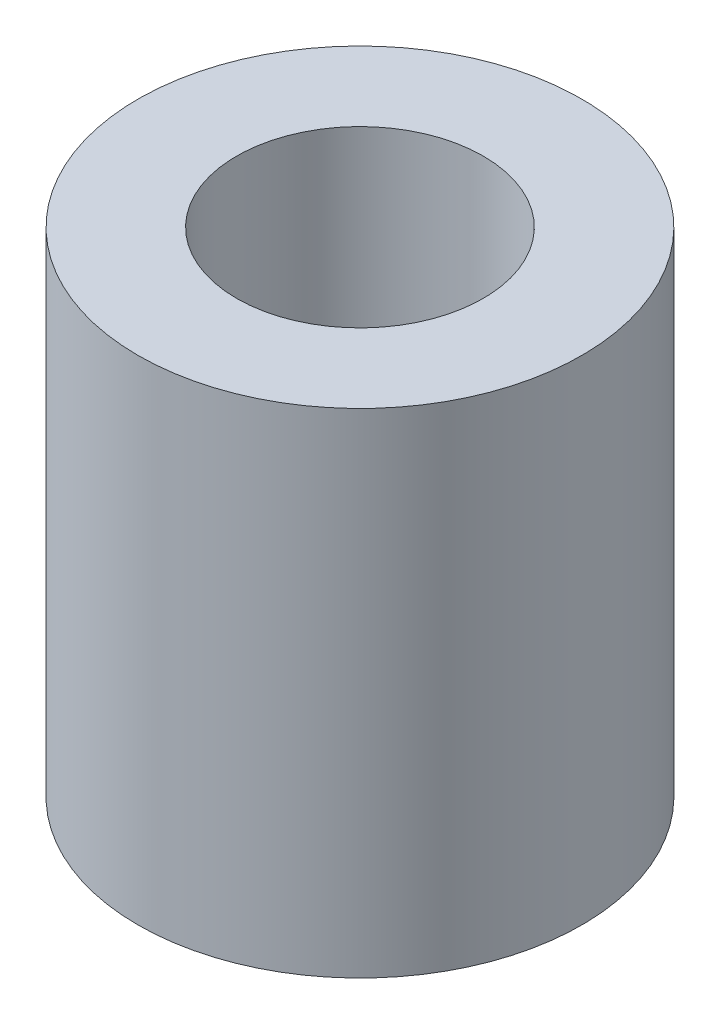
ISO-10303-21;
HEADER;
FILE_DESCRIPTION(('STEP AP214'),'2;1');
FILE_NAME('part.step','',(''),(''),'','','');
FILE_SCHEMA(('AUTOMOTIVE_DESIGN { 1 0 10303 214 1 1 1 1 }'));
ENDSEC;
DATA;
#1=APPLICATION_CONTEXT('core data for automotive mechanical design processes');
#2=APPLICATION_PROTOCOL_DEFINITION('international standard','automotive_design',2000,#1);
#3=PRODUCT_CONTEXT('',#1,'mechanical');
#4=PRODUCT('Part','Part','',(#3));
#5=PRODUCT_RELATED_PRODUCT_CATEGORY('part','',(#4));
#6=PRODUCT_DEFINITION_FORMATION('','',#4);
#7=PRODUCT_DEFINITION_CONTEXT('part definition',#1,'design');
#8=PRODUCT_DEFINITION('design','',#6,#7);
#9=PRODUCT_DEFINITION_SHAPE('','',#8);
#10=(LENGTH_UNIT() NAMED_UNIT(*) SI_UNIT(.MILLI.,.METRE.));
#11=(NAMED_UNIT(*) PLANE_ANGLE_UNIT() SI_UNIT($,.RADIAN.));
#12=(NAMED_UNIT(*) SI_UNIT($,.STERADIAN.) SOLID_ANGLE_UNIT());
#13=UNCERTAINTY_MEASURE_WITH_UNIT(LENGTH_MEASURE(1.E-05),#10,'distance_accuracy_value','');
#14=(GEOMETRIC_REPRESENTATION_CONTEXT(3) GLOBAL_UNCERTAINTY_ASSIGNED_CONTEXT((#13)) GLOBAL_UNIT_ASSIGNED_CONTEXT((#10,
#11,#12)) REPRESENTATION_CONTEXT('',''));
#15=CARTESIAN_POINT('',(0.,0.,0.));
#16=DIRECTION('',(0.,0.,1.));
#17=DIRECTION('',(1.,0.,0.));
#18=AXIS2_PLACEMENT_3D('',#15,#16,#17);
#19=CARTESIAN_POINT('',(0.,5.,0.));
#20=DIRECTION('',(0.,1.,0.));
#21=DIRECTION('',(0.,0.,1.));
#22=AXIS2_PLACEMENT_3D('',#19,#20,#21);
#23=PLANE('',#22);
#24=CARTESIAN_POINT('',(0.,5.,0.));
#25=DIRECTION('',(0.,1.,0.));
#26=DIRECTION('',(0.,0.,1.));
#27=AXIS2_PLACEMENT_3D('',#24,#25,#26);
#28=CIRCLE('',#27,4.5);
#29=CARTESIAN_POINT('',(0.,5.,4.5));
#30=VERTEX_POINT('',#29);
#31=EDGE_CURVE('E10',#30,#30,#28,.T.);
#32=ORIENTED_EDGE('',*,*,#31,.T.);
#33=EDGE_LOOP('',(#32));
#34=FACE_BOUND('',#33,.T.);
#35=CARTESIAN_POINT('',(0.,5.,0.));
#36=DIRECTION('',(0.,1.,0.));
#37=DIRECTION('',(0.,0.,1.));
#38=AXIS2_PLACEMENT_3D('',#35,#36,#37);
#39=CIRCLE('',#38,2.5);
#40=CARTESIAN_POINT('',(0.,5.,2.5));
#41=VERTEX_POINT('',#40);
#42=EDGE_CURVE('E50',#41,#41,#39,.T.);
#43=ORIENTED_EDGE('',*,*,#42,.F.);
#44=EDGE_LOOP('',(#43));
#45=FACE_BOUND('',#44,.T.);
#46=ADVANCED_FACE('F37',(#34,#45),#23,.T.);
#47=CARTESIAN_POINT('',(0.,-5.,0.));
#48=DIRECTION('',(0.,1.,0.));
#49=DIRECTION('',(0.,0.,1.));
#50=AXIS2_PLACEMENT_3D('',#47,#48,#49);
#51=PLANE('',#50);
#52=CARTESIAN_POINT('',(0.,-5.,0.));
#53=DIRECTION('',(0.,1.,0.));
#54=DIRECTION('',(0.,0.,1.));
#55=AXIS2_PLACEMENT_3D('',#52,#53,#54);
#56=CIRCLE('',#55,4.5);
#57=CARTESIAN_POINT('',(0.,-5.,4.5));
#58=VERTEX_POINT('',#57);
#59=EDGE_CURVE('E41',#58,#58,#56,.T.);
#60=ORIENTED_EDGE('',*,*,#59,.F.);
#61=EDGE_LOOP('',(#60));
#62=FACE_BOUND('',#61,.T.);
#63=CARTESIAN_POINT('',(0.,-5.,0.));
#64=DIRECTION('',(0.,1.,0.));
#65=DIRECTION('',(0.,0.,1.));
#66=AXIS2_PLACEMENT_3D('',#63,#64,#65);
#67=CIRCLE('',#66,2.5);
#68=CARTESIAN_POINT('',(0.,-5.,2.5));
#69=VERTEX_POINT('',#68);
#70=EDGE_CURVE('E52',#69,#69,#67,.T.);
#71=ORIENTED_EDGE('',*,*,#70,.T.);
#72=EDGE_LOOP('',(#71));
#73=FACE_BOUND('',#72,.T.);
#74=ADVANCED_FACE('F64',(#62,#73),#51,.F.);
#75=CARTESIAN_POINT('',(0.,5.,0.));
#76=DIRECTION('',(0.,-1.,0.));
#77=DIRECTION('',(0.,0.,-1.));
#78=AXIS2_PLACEMENT_3D('',#75,#76,#77);
#79=CYLINDRICAL_SURFACE('',#78,4.5);
#80=ORIENTED_EDGE('',*,*,#31,.F.);
#81=EDGE_LOOP('',(#80));
#82=FACE_BOUND('',#81,.T.);
#83=ORIENTED_EDGE('',*,*,#59,.T.);
#84=EDGE_LOOP('',(#83));
#85=FACE_BOUND('',#84,.T.);
#86=ADVANCED_FACE('F39',(#82,#85),#79,.T.);
#87=CARTESIAN_POINT('',(0.,5.,0.));
#88=DIRECTION('',(0.,-1.,0.));
#89=DIRECTION('',(0.,0.,-1.));
#90=AXIS2_PLACEMENT_3D('',#87,#88,#89);
#91=CYLINDRICAL_SURFACE('',#90,2.5);
#92=ORIENTED_EDGE('',*,*,#42,.T.);
#93=EDGE_LOOP('',(#92));
#94=FACE_BOUND('',#93,.T.);
#95=ORIENTED_EDGE('',*,*,#70,.F.);
#96=EDGE_LOOP('',(#95));
#97=FACE_BOUND('',#96,.T.);
#98=ADVANCED_FACE('F60',(#94,#97),#91,.F.);
#99=CLOSED_SHELL('',(#46,#74,#86,#98));
#100=MANIFOLD_SOLID_BREP('B2',#99);
#101=ADVANCED_BREP_SHAPE_REPRESENTATION('',(#18,#100),#14);
#102=SHAPE_DEFINITION_REPRESENTATION(#9,#101);
ENDSEC;
END-ISO-10303-21;
